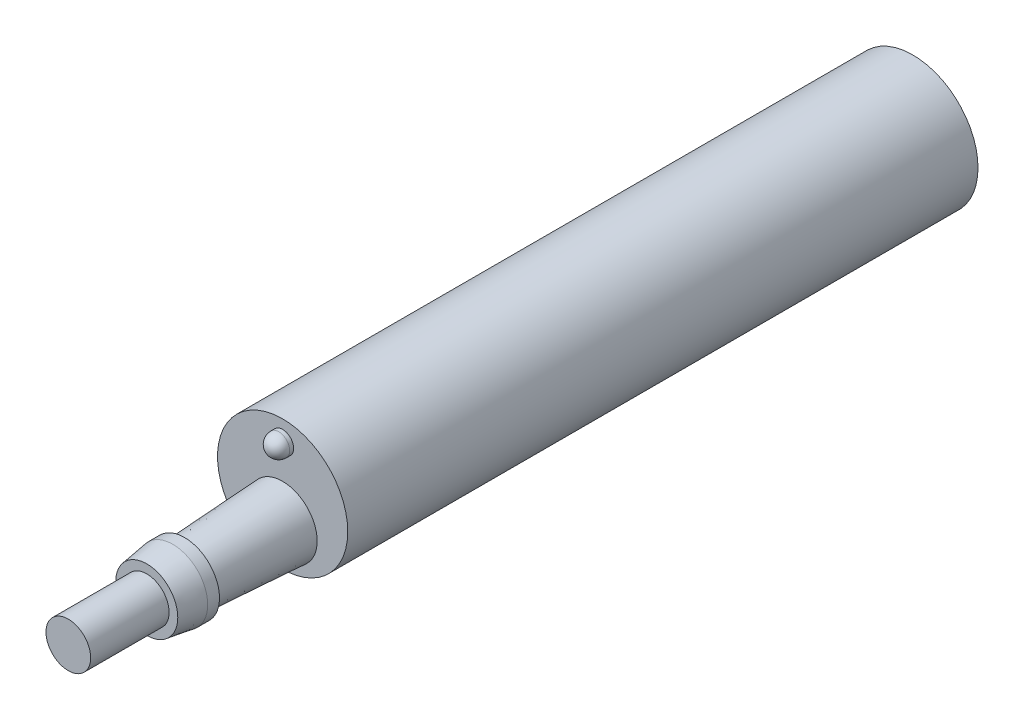
ISO-10303-21;
HEADER;
FILE_DESCRIPTION(('STEP AP214'),'2;1');
FILE_NAME('part.step','',(''),(''),'','','');
FILE_SCHEMA(('AUTOMOTIVE_DESIGN { 1 0 10303 214 1 1 1 1 }'));
ENDSEC;
DATA;
#1=APPLICATION_CONTEXT('core data for automotive mechanical design processes');
#2=APPLICATION_PROTOCOL_DEFINITION('international standard','automotive_design',2000,#1);
#3=PRODUCT_CONTEXT('',#1,'mechanical');
#4=PRODUCT('Part','Part','',(#3));
#5=PRODUCT_RELATED_PRODUCT_CATEGORY('part','',(#4));
#6=PRODUCT_DEFINITION_FORMATION('','',#4);
#7=PRODUCT_DEFINITION_CONTEXT('part definition',#1,'design');
#8=PRODUCT_DEFINITION('design','',#6,#7);
#9=PRODUCT_DEFINITION_SHAPE('','',#8);
#10=(LENGTH_UNIT() NAMED_UNIT(*) SI_UNIT(.MILLI.,.METRE.));
#11=(NAMED_UNIT(*) PLANE_ANGLE_UNIT() SI_UNIT($,.RADIAN.));
#12=(NAMED_UNIT(*) SI_UNIT($,.STERADIAN.) SOLID_ANGLE_UNIT());
#13=UNCERTAINTY_MEASURE_WITH_UNIT(LENGTH_MEASURE(1.E-05),#10,'distance_accuracy_value','');
#14=(GEOMETRIC_REPRESENTATION_CONTEXT(3) GLOBAL_UNCERTAINTY_ASSIGNED_CONTEXT((#13)) GLOBAL_UNIT_ASSIGNED_CONTEXT((#10,
#11,#12)) REPRESENTATION_CONTEXT('',''));
#15=CARTESIAN_POINT('',(0.,0.,0.));
#16=DIRECTION('',(0.,0.,1.));
#17=DIRECTION('',(1.,0.,0.));
#18=AXIS2_PLACEMENT_3D('',#15,#16,#17);
#19=CARTESIAN_POINT('',(0.,-3.,97.66));
#20=DIRECTION('',(0.,0.,1.));
#21=DIRECTION('',(1.,0.,0.));
#22=AXIS2_PLACEMENT_3D('',#19,#20,#21);
#23=PLANE('',#22);
#24=CARTESIAN_POINT('',(0.,-3.,97.66));
#25=DIRECTION('',(0.,0.,1.));
#26=DIRECTION('',(1.,0.,0.));
#27=AXIS2_PLACEMENT_3D('',#24,#25,#26);
#28=CIRCLE('',#27,3.95382267552089);
#29=CARTESIAN_POINT('',(3.95382267552089,-3.,97.66));
#30=VERTEX_POINT('',#29);
#31=EDGE_CURVE('E58',#30,#30,#28,.T.);
#32=ORIENTED_EDGE('',*,*,#31,.T.);
#33=EDGE_LOOP('',(#32));
#34=FACE_BOUND('',#33,.T.);
#35=CARTESIAN_POINT('',(0.,-3.,97.66));
#36=DIRECTION('',(0.,0.,1.));
#37=DIRECTION('',(1.,0.,0.));
#38=AXIS2_PLACEMENT_3D('',#35,#36,#37);
#39=CIRCLE('',#38,2.85);
#40=CARTESIAN_POINT('',(2.85,-3.,97.66));
#41=VERTEX_POINT('',#40);
#42=EDGE_CURVE('E64',#41,#41,#39,.T.);
#43=ORIENTED_EDGE('',*,*,#42,.F.);
#44=EDGE_LOOP('',(#43));
#45=FACE_BOUND('',#44,.T.);
#46=ADVANCED_FACE('F31',(#34,#45),#23,.T.);
#47=CARTESIAN_POINT('',(0.,0.,80.34));
#48=DIRECTION('',(0.,0.,1.));
#49=DIRECTION('',(1.,0.,0.));
#50=AXIS2_PLACEMENT_3D('',#47,#48,#49);
#51=PLANE('',#50);
#52=CARTESIAN_POINT('',(0.,5.73,80.34));
#53=DIRECTION('',(0.,0.,1.));
#54=DIRECTION('',(1.,0.,0.));
#55=AXIS2_PLACEMENT_3D('',#52,#53,#54);
#56=CIRCLE('',#55,1.4);
#57=CARTESIAN_POINT('',(1.4,5.73,80.34));
#58=VERTEX_POINT('',#57);
#59=EDGE_CURVE('E45',#58,#58,#56,.T.);
#60=ORIENTED_EDGE('',*,*,#59,.F.);
#61=EDGE_LOOP('',(#60));
#62=FACE_BOUND('',#61,.T.);
#63=CARTESIAN_POINT('',(0.,0.,80.34));
#64=DIRECTION('',(0.,0.,1.));
#65=DIRECTION('',(1.,0.,0.));
#66=AXIS2_PLACEMENT_3D('',#63,#64,#65);
#67=CIRCLE('',#66,8.3);
#68=CARTESIAN_POINT('',(8.3,0.,80.34));
#69=VERTEX_POINT('',#68);
#70=EDGE_CURVE('E10',#69,#69,#67,.T.);
#71=ORIENTED_EDGE('',*,*,#70,.T.);
#72=EDGE_LOOP('',(#71));
#73=FACE_BOUND('',#72,.T.);
#74=CARTESIAN_POINT('',(0.,-3.,80.34));
#75=DIRECTION('',(0.,0.,1.));
#76=DIRECTION('',(1.,0.,0.));
#77=AXIS2_PLACEMENT_3D('',#74,#75,#76);
#78=CIRCLE('',#77,4.4);
#79=CARTESIAN_POINT('',(4.4,-3.,80.34));
#80=VERTEX_POINT('',#79);
#81=EDGE_CURVE('E51',#80,#80,#78,.T.);
#82=ORIENTED_EDGE('',*,*,#81,.F.);
#83=EDGE_LOOP('',(#82));
#84=FACE_BOUND('',#83,.T.);
#85=ADVANCED_FACE('F80',(#62,#73,#84),#51,.T.);
#86=CARTESIAN_POINT('',(0.,0.,80.34));
#87=DIRECTION('',(0.,0.,-1.));
#88=DIRECTION('',(-1.,0.,0.));
#89=AXIS2_PLACEMENT_3D('',#86,#87,#88);
#90=CYLINDRICAL_SURFACE('',#89,8.3);
#91=ORIENTED_EDGE('',*,*,#70,.F.);
#92=EDGE_LOOP('',(#91));
#93=FACE_BOUND('',#92,.T.);
#94=CARTESIAN_POINT('',(0.,0.,0.));
#95=DIRECTION('',(0.,0.,1.));
#96=DIRECTION('',(1.,0.,0.));
#97=AXIS2_PLACEMENT_3D('',#94,#95,#96);
#98=CIRCLE('',#97,8.3);
#99=CARTESIAN_POINT('',(8.3,0.,0.));
#100=VERTEX_POINT('',#99);
#101=EDGE_CURVE('E39',#100,#100,#98,.T.);
#102=ORIENTED_EDGE('',*,*,#101,.T.);
#103=EDGE_LOOP('',(#102));
#104=FACE_BOUND('',#103,.T.);
#105=ADVANCED_FACE('F86',(#93,#104),#90,.T.);
#106=CARTESIAN_POINT('',(0.,0.,0.));
#107=DIRECTION('',(0.,0.,1.));
#108=DIRECTION('',(1.,0.,0.));
#109=AXIS2_PLACEMENT_3D('',#106,#107,#108);
#110=PLANE('',#109);
#111=ORIENTED_EDGE('',*,*,#101,.F.);
#112=EDGE_LOOP('',(#111));
#113=FACE_BOUND('',#112,.T.);
#114=ADVANCED_FACE('F108',(#113),#110,.F.);
#115=CARTESIAN_POINT('',(0.,5.73,80.84));
#116=DIRECTION('',(0.,0.,-1.));
#117=DIRECTION('',(-1.,0.,0.));
#118=AXIS2_PLACEMENT_3D('',#115,#116,#117);
#119=CYLINDRICAL_SURFACE('',#118,1.4);
#120=CARTESIAN_POINT('',(0.,5.73,80.84));
#121=DIRECTION('',(0.,0.,1.));
#122=DIRECTION('',(1.,0.,0.));
#123=AXIS2_PLACEMENT_3D('',#120,#121,#122);
#124=CIRCLE('',#123,1.4);
#125=CARTESIAN_POINT('',(1.4,5.73,80.84));
#126=VERTEX_POINT('',#125);
#127=EDGE_CURVE('E35',#126,#126,#124,.T.);
#128=ORIENTED_EDGE('',*,*,#127,.F.);
#129=EDGE_LOOP('',(#128));
#130=FACE_BOUND('',#129,.T.);
#131=ORIENTED_EDGE('',*,*,#59,.T.);
#132=EDGE_LOOP('',(#131));
#133=FACE_BOUND('',#132,.T.);
#134=ADVANCED_FACE('F106',(#130,#133),#119,.T.);
#135=CARTESIAN_POINT('',(0.,5.73,80.84));
#136=DIRECTION('',(0.,0.,1.));
#137=DIRECTION('',(1.,0.,0.));
#138=AXIS2_PLACEMENT_3D('',#135,#136,#137);
#139=SPHERICAL_SURFACE('',#138,1.4);
#140=ORIENTED_EDGE('',*,*,#127,.T.);
#141=EDGE_LOOP('',(#140));
#142=FACE_BOUND('',#141,.T.);
#143=ADVANCED_FACE('F33',(#142),#139,.T.);
#144=CARTESIAN_POINT('',(0.,-3.,80.34));
#145=DIRECTION('',(0.,0.,-1.));
#146=DIRECTION('',(1.,0.,0.));
#147=AXIS2_PLACEMENT_3D('',#144,#145,#146);
#148=CONICAL_SURFACE('',#147,4.4,0.0558505360638187);
#149=CARTESIAN_POINT('',(0.,-3.,92.84));
#150=DIRECTION('',(0.,0.,1.));
#151=DIRECTION('',(1.,0.,0.));
#152=AXIS2_PLACEMENT_3D('',#149,#150,#151);
#153=CIRCLE('',#152,3.70114150238424);
#154=CARTESIAN_POINT('',(3.70114150238424,-3.,92.84));
#155=VERTEX_POINT('',#154);
#156=EDGE_CURVE('E48',#155,#155,#153,.T.);
#157=ORIENTED_EDGE('',*,*,#156,.F.);
#158=EDGE_LOOP('',(#157));
#159=FACE_BOUND('',#158,.T.);
#160=ORIENTED_EDGE('',*,*,#81,.T.);
#161=EDGE_LOOP('',(#160));
#162=FACE_BOUND('',#161,.T.);
#163=ADVANCED_FACE('F98',(#159,#162),#148,.T.);
#164=CARTESIAN_POINT('',(0.,-3.,92.84));
#165=DIRECTION('',(0.,0.,1.));
#166=DIRECTION('',(1.,0.,0.));
#167=AXIS2_PLACEMENT_3D('',#164,#165,#166);
#168=PLANE('',#167);
#169=CARTESIAN_POINT('',(0.,-3.,92.84));
#170=DIRECTION('',(0.,0.,1.));
#171=DIRECTION('',(1.,0.,0.));
#172=AXIS2_PLACEMENT_3D('',#169,#170,#171);
#173=CIRCLE('',#172,4.45);
#174=CARTESIAN_POINT('',(4.45,-3.,92.84));
#175=VERTEX_POINT('',#174);
#176=EDGE_CURVE('E55',#175,#175,#173,.T.);
#177=ORIENTED_EDGE('',*,*,#176,.F.);
#178=EDGE_LOOP('',(#177));
#179=FACE_BOUND('',#178,.T.);
#180=ORIENTED_EDGE('',*,*,#156,.T.);
#181=EDGE_LOOP('',(#180));
#182=FACE_BOUND('',#181,.T.);
#183=ADVANCED_FACE('F95',(#179,#182),#168,.F.);
#184=CARTESIAN_POINT('',(0.,-3.,94.34));
#185=DIRECTION('',(0.,0.,-1.));
#186=DIRECTION('',(-1.,0.,0.));
#187=AXIS2_PLACEMENT_3D('',#184,#185,#186);
#188=CYLINDRICAL_SURFACE('',#187,4.45);
#189=CARTESIAN_POINT('',(0.,-3.,94.34));
#190=DIRECTION('',(0.,0.,1.));
#191=DIRECTION('',(1.,0.,0.));
#192=AXIS2_PLACEMENT_3D('',#189,#190,#191);
#193=CIRCLE('',#192,4.45);
#194=CARTESIAN_POINT('',(4.45,-3.,94.34));
#195=VERTEX_POINT('',#194);
#196=EDGE_CURVE('E54',#195,#195,#193,.T.);
#197=ORIENTED_EDGE('',*,*,#196,.F.);
#198=EDGE_LOOP('',(#197));
#199=FACE_BOUND('',#198,.T.);
#200=ORIENTED_EDGE('',*,*,#176,.T.);
#201=EDGE_LOOP('',(#200));
#202=FACE_BOUND('',#201,.T.);
#203=ADVANCED_FACE('F93',(#199,#202),#188,.T.);
#204=CARTESIAN_POINT('',(0.,-3.,94.34));
#205=DIRECTION('',(0.,0.,-1.));
#206=DIRECTION('',(1.,0.,0.));
#207=AXIS2_PLACEMENT_3D('',#204,#205,#206);
#208=CONICAL_SURFACE('',#207,4.45,0.148352986419518);
#209=ORIENTED_EDGE('',*,*,#31,.F.);
#210=EDGE_LOOP('',(#209));
#211=FACE_BOUND('',#210,.T.);
#212=ORIENTED_EDGE('',*,*,#196,.T.);
#213=EDGE_LOOP('',(#212));
#214=FACE_BOUND('',#213,.T.);
#215=ADVANCED_FACE('F75',(#211,#214),#208,.T.);
#216=CARTESIAN_POINT('',(0.,-3.,107.66));
#217=DIRECTION('',(0.,0.,-1.));
#218=DIRECTION('',(-1.,0.,0.));
#219=AXIS2_PLACEMENT_3D('',#216,#217,#218);
#220=CYLINDRICAL_SURFACE('',#219,2.85);
#221=CARTESIAN_POINT('',(0.,-3.,107.66));
#222=DIRECTION('',(0.,0.,1.));
#223=DIRECTION('',(1.,0.,0.));
#224=AXIS2_PLACEMENT_3D('',#221,#222,#223);
#225=CIRCLE('',#224,2.85);
#226=CARTESIAN_POINT('',(2.85,-3.,107.66));
#227=VERTEX_POINT('',#226);
#228=EDGE_CURVE('E63',#227,#227,#225,.T.);
#229=ORIENTED_EDGE('',*,*,#228,.F.);
#230=EDGE_LOOP('',(#229));
#231=FACE_BOUND('',#230,.T.);
#232=ORIENTED_EDGE('',*,*,#42,.T.);
#233=EDGE_LOOP('',(#232));
#234=FACE_BOUND('',#233,.T.);
#235=ADVANCED_FACE('F72',(#231,#234),#220,.T.);
#236=CARTESIAN_POINT('',(0.,-3.,107.66));
#237=DIRECTION('',(0.,0.,1.));
#238=DIRECTION('',(1.,0.,0.));
#239=AXIS2_PLACEMENT_3D('',#236,#237,#238);
#240=PLANE('',#239);
#241=ORIENTED_EDGE('',*,*,#228,.T.);
#242=EDGE_LOOP('',(#241));
#243=FACE_BOUND('',#242,.T.);
#244=ADVANCED_FACE('F70',(#243),#240,.T.);
#245=CLOSED_SHELL('',(#46,#85,#105,#114,#134,#143,#163,#183,#203,#215,#235,#244));
#246=MANIFOLD_SOLID_BREP('B2',#245);
#247=ADVANCED_BREP_SHAPE_REPRESENTATION('',(#18,#246),#14);
#248=SHAPE_DEFINITION_REPRESENTATION(#9,#247);
ENDSEC;
END-ISO-10303-21;
